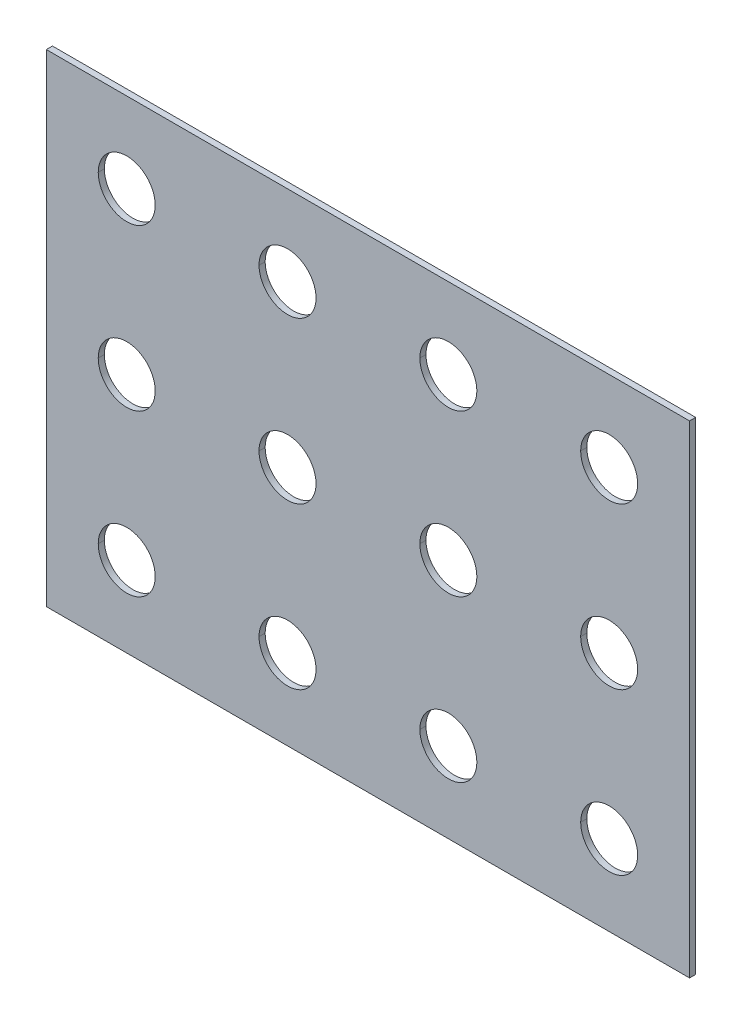
ISO-10303-21;
HEADER;
FILE_DESCRIPTION(('STEP AP214'),'2;1');
FILE_NAME('part.step','',(''),(''),'','','');
FILE_SCHEMA(('AUTOMOTIVE_DESIGN { 1 0 10303 214 1 1 1 1 }'));
ENDSEC;
DATA;
#1=APPLICATION_CONTEXT('core data for automotive mechanical design processes');
#2=APPLICATION_PROTOCOL_DEFINITION('international standard','automotive_design',2000,#1);
#3=PRODUCT_CONTEXT('',#1,'mechanical');
#4=PRODUCT('Part','Part','',(#3));
#5=PRODUCT_RELATED_PRODUCT_CATEGORY('part','',(#4));
#6=PRODUCT_DEFINITION_FORMATION('','',#4);
#7=PRODUCT_DEFINITION_CONTEXT('part definition',#1,'design');
#8=PRODUCT_DEFINITION('design','',#6,#7);
#9=PRODUCT_DEFINITION_SHAPE('','',#8);
#10=(LENGTH_UNIT() NAMED_UNIT(*) SI_UNIT(.MILLI.,.METRE.));
#11=(NAMED_UNIT(*) PLANE_ANGLE_UNIT() SI_UNIT($,.RADIAN.));
#12=(NAMED_UNIT(*) SI_UNIT($,.STERADIAN.) SOLID_ANGLE_UNIT());
#13=UNCERTAINTY_MEASURE_WITH_UNIT(LENGTH_MEASURE(1.E-05),#10,'distance_accuracy_value','');
#14=(GEOMETRIC_REPRESENTATION_CONTEXT(3) GLOBAL_UNCERTAINTY_ASSIGNED_CONTEXT((#13)) GLOBAL_UNIT_ASSIGNED_CONTEXT((#10,
#11,#12)) REPRESENTATION_CONTEXT('',''));
#15=CARTESIAN_POINT('',(0.,0.,0.));
#16=DIRECTION('',(0.,0.,1.));
#17=DIRECTION('',(1.,0.,0.));
#18=AXIS2_PLACEMENT_3D('',#15,#16,#17);
#19=CARTESIAN_POINT('',(0.,0.,0.));
#20=DIRECTION('',(-1.,0.,0.));
#21=DIRECTION('',(0.,0.,1.));
#22=AXIS2_PLACEMENT_3D('',#19,#20,#21);
#23=PLANE('',#22);
#24=DIRECTION('',(0.,0.,1.));
#25=VECTOR('',#24,1.);
#26=CARTESIAN_POINT('',(0.,0.,0.));
#27=LINE('',#26,#25);
#28=CARTESIAN_POINT('',(0.,0.,0.));
#29=VERTEX_POINT('',#28);
#30=CARTESIAN_POINT('',(0.,0.,0.09652));
#31=VERTEX_POINT('',#30);
#32=EDGE_CURVE('E272',#29,#31,#27,.T.);
#33=ORIENTED_EDGE('',*,*,#32,.T.);
#34=DIRECTION('',(0.,1.,0.));
#35=VECTOR('',#34,1.);
#36=CARTESIAN_POINT('',(0.,0.,0.09652));
#37=LINE('',#36,#35);
#38=CARTESIAN_POINT('',(0.,7.619999885559,0.09652));
#39=VERTEX_POINT('',#38);
#40=EDGE_CURVE('E280',#31,#39,#37,.T.);
#41=ORIENTED_EDGE('',*,*,#40,.T.);
#42=DIRECTION('',(0.,0.,1.));
#43=VECTOR('',#42,1.);
#44=CARTESIAN_POINT('',(0.,7.619999885559,0.));
#45=LINE('',#44,#43);
#46=CARTESIAN_POINT('',(0.,7.619999885559,0.));
#47=VERTEX_POINT('',#46);
#48=EDGE_CURVE('E11',#47,#39,#45,.T.);
#49=ORIENTED_EDGE('',*,*,#48,.F.);
#50=DIRECTION('',(0.,1.,0.));
#51=VECTOR('',#50,1.);
#52=CARTESIAN_POINT('',(0.,0.,0.));
#53=LINE('',#52,#51);
#54=EDGE_CURVE('E309',#29,#47,#53,.T.);
#55=ORIENTED_EDGE('',*,*,#54,.F.);
#56=EDGE_LOOP('',(#33,#41,#49,#55));
#57=FACE_BOUND('',#56,.T.);
#58=ADVANCED_FACE('F16',(#57),#23,.T.);
#59=CARTESIAN_POINT('',(0.,7.619999885559,0.));
#60=DIRECTION('',(0.,1.,0.));
#61=DIRECTION('',(1.,0.,0.));
#62=AXIS2_PLACEMENT_3D('',#59,#60,#61);
#63=PLANE('',#62);
#64=ORIENTED_EDGE('',*,*,#48,.T.);
#65=DIRECTION('',(1.,0.,0.));
#66=VECTOR('',#65,1.);
#67=CARTESIAN_POINT('',(0.,7.619999885559,0.09652));
#68=LINE('',#67,#66);
#69=CARTESIAN_POINT('',(10.159999847412,7.619999885559,0.09652));
#70=VERTEX_POINT('',#69);
#71=EDGE_CURVE('E275',#39,#70,#68,.T.);
#72=ORIENTED_EDGE('',*,*,#71,.T.);
#73=DIRECTION('',(0.,0.,1.));
#74=VECTOR('',#73,1.);
#75=CARTESIAN_POINT('',(10.159999847412,7.619999885559,0.));
#76=LINE('',#75,#74);
#77=CARTESIAN_POINT('',(10.159999847412,7.619999885559,0.));
#78=VERTEX_POINT('',#77);
#79=EDGE_CURVE('E27',#78,#70,#76,.T.);
#80=ORIENTED_EDGE('',*,*,#79,.F.);
#81=DIRECTION('',(1.,0.,0.));
#82=VECTOR('',#81,1.);
#83=CARTESIAN_POINT('',(0.,7.619999885559,0.));
#84=LINE('',#83,#82);
#85=EDGE_CURVE('E421',#47,#78,#84,.T.);
#86=ORIENTED_EDGE('',*,*,#85,.F.);
#87=EDGE_LOOP('',(#64,#72,#80,#86));
#88=FACE_BOUND('',#87,.T.);
#89=ADVANCED_FACE('F18',(#88),#63,.T.);
#90=CARTESIAN_POINT('',(10.159999847412,7.619999885559,0.));
#91=DIRECTION('',(1.,0.,0.));
#92=DIRECTION('',(0.,1.,0.));
#93=AXIS2_PLACEMENT_3D('',#90,#91,#92);
#94=PLANE('',#93);
#95=ORIENTED_EDGE('',*,*,#79,.T.);
#96=DIRECTION('',(0.,-1.,0.));
#97=VECTOR('',#96,1.);
#98=CARTESIAN_POINT('',(10.159999847412,7.619999885559,0.09652));
#99=LINE('',#98,#97);
#100=CARTESIAN_POINT('',(10.159999847412,0.,0.09652));
#101=VERTEX_POINT('',#100);
#102=EDGE_CURVE('E264',#70,#101,#99,.T.);
#103=ORIENTED_EDGE('',*,*,#102,.T.);
#104=DIRECTION('',(0.,0.,1.));
#105=VECTOR('',#104,1.);
#106=CARTESIAN_POINT('',(10.159999847412,0.,0.));
#107=LINE('',#106,#105);
#108=CARTESIAN_POINT('',(10.159999847412,0.,0.));
#109=VERTEX_POINT('',#108);
#110=EDGE_CURVE('E42',#109,#101,#107,.T.);
#111=ORIENTED_EDGE('',*,*,#110,.F.);
#112=DIRECTION('',(0.,-1.,0.));
#113=VECTOR('',#112,1.);
#114=CARTESIAN_POINT('',(10.159999847412,7.619999885559,0.));
#115=LINE('',#114,#113);
#116=EDGE_CURVE('E267',#78,#109,#115,.T.);
#117=ORIENTED_EDGE('',*,*,#116,.F.);
#118=EDGE_LOOP('',(#95,#103,#111,#117));
#119=FACE_BOUND('',#118,.T.);
#120=ADVANCED_FACE('F262',(#119),#94,.T.);
#121=CARTESIAN_POINT('',(10.159999847412,0.,0.));
#122=DIRECTION('',(0.,-1.,0.));
#123=DIRECTION('',(0.,0.,-1.));
#124=AXIS2_PLACEMENT_3D('',#121,#122,#123);
#125=PLANE('',#124);
#126=ORIENTED_EDGE('',*,*,#110,.T.);
#127=DIRECTION('',(-1.,0.,0.));
#128=VECTOR('',#127,1.);
#129=CARTESIAN_POINT('',(10.159999847412,0.,0.09652));
#130=LINE('',#129,#128);
#131=EDGE_CURVE('E284',#101,#31,#130,.T.);
#132=ORIENTED_EDGE('',*,*,#131,.T.);
#133=ORIENTED_EDGE('',*,*,#32,.F.);
#134=DIRECTION('',(-1.,0.,0.));
#135=VECTOR('',#134,1.);
#136=CARTESIAN_POINT('',(10.159999847412,0.,0.));
#137=LINE('',#136,#135);
#138=EDGE_CURVE('E420',#109,#29,#137,.T.);
#139=ORIENTED_EDGE('',*,*,#138,.F.);
#140=EDGE_LOOP('',(#126,#132,#133,#139));
#141=FACE_BOUND('',#140,.T.);
#142=ADVANCED_FACE('F1299',(#141),#125,.T.);
#143=CARTESIAN_POINT('',(1.27,3.81,0.));
#144=DIRECTION('',(0.,0.,-1.));
#145=DIRECTION('',(1.,0.,0.));
#146=AXIS2_PLACEMENT_3D('',#143,#144,#145);
#147=CYLINDRICAL_SURFACE('',#146,0.4499991);
#148=DIRECTION('',(0.,0.,-1.));
#149=VECTOR('',#148,1.);
#150=CARTESIAN_POINT('',(0.8200009,3.81,0.));
#151=LINE('',#150,#149);
#152=CARTESIAN_POINT('',(0.8200009,3.81,0.09652));
#153=VERTEX_POINT('',#152);
#154=CARTESIAN_POINT('',(0.8200009,3.81,0.));
#155=VERTEX_POINT('',#154);
#156=EDGE_CURVE('E409',#153,#155,#151,.T.);
#157=ORIENTED_EDGE('',*,*,#156,.F.);
#158=CARTESIAN_POINT('',(1.27,3.81,0.09652));
#159=DIRECTION('',(0.,0.,1.));
#160=DIRECTION('',(1.,0.,0.));
#161=AXIS2_PLACEMENT_3D('',#158,#159,#160);
#162=CIRCLE('',#161,0.4499991);
#163=CARTESIAN_POINT('',(1.7199991,3.81,0.09652));
#164=VERTEX_POINT('',#163);
#165=EDGE_CURVE('E306',#153,#164,#162,.T.);
#166=ORIENTED_EDGE('',*,*,#165,.T.);
#167=DIRECTION('',(0.,0.,-1.));
#168=VECTOR('',#167,1.);
#169=CARTESIAN_POINT('',(1.7199991,3.81,0.));
#170=LINE('',#169,#168);
#171=CARTESIAN_POINT('',(1.7199991,3.81,0.));
#172=VERTEX_POINT('',#171);
#173=EDGE_CURVE('E437',#164,#172,#170,.T.);
#174=ORIENTED_EDGE('',*,*,#173,.T.);
#175=CARTESIAN_POINT('',(1.27,3.81,0.));
#176=DIRECTION('',(0.,0.,1.));
#177=DIRECTION('',(1.,0.,0.));
#178=AXIS2_PLACEMENT_3D('',#175,#176,#177);
#179=CIRCLE('',#178,0.4499991);
#180=EDGE_CURVE('E20',#155,#172,#179,.T.);
#181=ORIENTED_EDGE('',*,*,#180,.F.);
#182=EDGE_LOOP('',(#157,#166,#174,#181));
#183=FACE_BOUND('',#182,.T.);
#184=ADVANCED_FACE('F621',(#183),#147,.F.);
#185=CARTESIAN_POINT('',(3.81,1.27,0.));
#186=DIRECTION('',(0.,0.,-1.));
#187=DIRECTION('',(1.,0.,0.));
#188=AXIS2_PLACEMENT_3D('',#185,#186,#187);
#189=CYLINDRICAL_SURFACE('',#188,0.4499991);
#190=DIRECTION('',(0.,0.,-1.));
#191=VECTOR('',#190,1.);
#192=CARTESIAN_POINT('',(3.3600009,1.27,0.));
#193=LINE('',#192,#191);
#194=CARTESIAN_POINT('',(3.3600009,1.27,0.09652));
#195=VERTEX_POINT('',#194);
#196=CARTESIAN_POINT('',(3.3600009,1.27,0.));
#197=VERTEX_POINT('',#196);
#198=EDGE_CURVE('E340',#195,#197,#193,.T.);
#199=ORIENTED_EDGE('',*,*,#198,.F.);
#200=CARTESIAN_POINT('',(3.81,1.27,0.09652));
#201=DIRECTION('',(0.,0.,1.));
#202=DIRECTION('',(1.,0.,0.));
#203=AXIS2_PLACEMENT_3D('',#200,#201,#202);
#204=CIRCLE('',#203,0.4499991);
#205=CARTESIAN_POINT('',(4.2599991,1.27,0.09652));
#206=VERTEX_POINT('',#205);
#207=EDGE_CURVE('E300',#195,#206,#204,.T.);
#208=ORIENTED_EDGE('',*,*,#207,.T.);
#209=DIRECTION('',(0.,0.,-1.));
#210=VECTOR('',#209,1.);
#211=CARTESIAN_POINT('',(4.2599991,1.27,0.));
#212=LINE('',#211,#210);
#213=CARTESIAN_POINT('',(4.2599991,1.27,0.));
#214=VERTEX_POINT('',#213);
#215=EDGE_CURVE('E388',#206,#214,#212,.T.);
#216=ORIENTED_EDGE('',*,*,#215,.T.);
#217=CARTESIAN_POINT('',(3.81,1.27,0.));
#218=DIRECTION('',(0.,0.,1.));
#219=DIRECTION('',(1.,0.,0.));
#220=AXIS2_PLACEMENT_3D('',#217,#218,#219);
#221=CIRCLE('',#220,0.4499991);
#222=EDGE_CURVE('E363',#197,#214,#221,.T.);
#223=ORIENTED_EDGE('',*,*,#222,.F.);
#224=EDGE_LOOP('',(#199,#208,#216,#223));
#225=FACE_BOUND('',#224,.T.);
#226=ADVANCED_FACE('F1278',(#225),#189,.F.);
#227=CARTESIAN_POINT('',(1.27,1.27,0.));
#228=DIRECTION('',(0.,0.,-1.));
#229=DIRECTION('',(1.,0.,0.));
#230=AXIS2_PLACEMENT_3D('',#227,#228,#229);
#231=CYLINDRICAL_SURFACE('',#230,0.4499991);
#232=DIRECTION('',(0.,0.,-1.));
#233=VECTOR('',#232,1.);
#234=CARTESIAN_POINT('',(0.8200009,1.27,0.));
#235=LINE('',#234,#233);
#236=CARTESIAN_POINT('',(0.8200009,1.27,0.09652));
#237=VERTEX_POINT('',#236);
#238=CARTESIAN_POINT('',(0.8200009,1.27,0.));
#239=VERTEX_POINT('',#238);
#240=EDGE_CURVE('E319',#237,#239,#235,.T.);
#241=ORIENTED_EDGE('',*,*,#240,.F.);
#242=CARTESIAN_POINT('',(1.27,1.27,0.09652));
#243=DIRECTION('',(0.,0.,1.));
#244=DIRECTION('',(1.,0.,0.));
#245=AXIS2_PLACEMENT_3D('',#242,#243,#244);
#246=CIRCLE('',#245,0.4499991);
#247=CARTESIAN_POINT('',(1.7199991,1.27,0.09652));
#248=VERTEX_POINT('',#247);
#249=EDGE_CURVE('E297',#237,#248,#246,.T.);
#250=ORIENTED_EDGE('',*,*,#249,.T.);
#251=DIRECTION('',(0.,0.,-1.));
#252=VECTOR('',#251,1.);
#253=CARTESIAN_POINT('',(1.7199991,1.27,0.));
#254=LINE('',#253,#252);
#255=CARTESIAN_POINT('',(1.7199991,1.27,0.));
#256=VERTEX_POINT('',#255);
#257=EDGE_CURVE('E455',#248,#256,#254,.T.);
#258=ORIENTED_EDGE('',*,*,#257,.T.);
#259=CARTESIAN_POINT('',(1.27,1.27,0.));
#260=DIRECTION('',(0.,0.,1.));
#261=DIRECTION('',(1.,0.,0.));
#262=AXIS2_PLACEMENT_3D('',#259,#260,#261);
#263=CIRCLE('',#262,0.4499991);
#264=EDGE_CURVE('E146',#239,#256,#263,.T.);
#265=ORIENTED_EDGE('',*,*,#264,.F.);
#266=EDGE_LOOP('',(#241,#250,#258,#265));
#267=FACE_BOUND('',#266,.T.);
#268=ADVANCED_FACE('F1267',(#267),#231,.F.);
#269=CARTESIAN_POINT('',(1.27,6.35,0.));
#270=DIRECTION('',(0.,0.,-1.));
#271=DIRECTION('',(1.,0.,0.));
#272=AXIS2_PLACEMENT_3D('',#269,#270,#271);
#273=CYLINDRICAL_SURFACE('',#272,0.4499991);
#274=DIRECTION('',(0.,0.,-1.));
#275=VECTOR('',#274,1.);
#276=CARTESIAN_POINT('',(0.8200009,6.35,0.));
#277=LINE('',#276,#275);
#278=CARTESIAN_POINT('',(0.8200009,6.35,0.09652));
#279=VERTEX_POINT('',#278);
#280=CARTESIAN_POINT('',(0.8200009,6.35,0.));
#281=VERTEX_POINT('',#280);
#282=EDGE_CURVE('E357',#279,#281,#277,.T.);
#283=ORIENTED_EDGE('',*,*,#282,.F.);
#284=CARTESIAN_POINT('',(1.27,6.35,0.09652));
#285=DIRECTION('',(0.,0.,1.));
#286=DIRECTION('',(1.,0.,0.));
#287=AXIS2_PLACEMENT_3D('',#284,#285,#286);
#288=CIRCLE('',#287,0.4499991);
#289=CARTESIAN_POINT('',(1.7199991,6.35,0.09652));
#290=VERTEX_POINT('',#289);
#291=EDGE_CURVE('E130',#279,#290,#288,.T.);
#292=ORIENTED_EDGE('',*,*,#291,.T.);
#293=DIRECTION('',(0.,0.,-1.));
#294=VECTOR('',#293,1.);
#295=CARTESIAN_POINT('',(1.7199991,6.35,0.));
#296=LINE('',#295,#294);
#297=CARTESIAN_POINT('',(1.7199991,6.35,0.));
#298=VERTEX_POINT('',#297);
#299=EDGE_CURVE('E356',#290,#298,#296,.T.);
#300=ORIENTED_EDGE('',*,*,#299,.T.);
#301=CARTESIAN_POINT('',(1.27,6.35,0.));
#302=DIRECTION('',(0.,0.,1.));
#303=DIRECTION('',(1.,0.,0.));
#304=AXIS2_PLACEMENT_3D('',#301,#302,#303);
#305=CIRCLE('',#304,0.4499991);
#306=EDGE_CURVE('E336',#281,#298,#305,.T.);
#307=ORIENTED_EDGE('',*,*,#306,.F.);
#308=EDGE_LOOP('',(#283,#292,#300,#307));
#309=FACE_BOUND('',#308,.T.);
#310=ADVANCED_FACE('F1256',(#309),#273,.F.);
#311=CARTESIAN_POINT('',(3.81,3.81,0.));
#312=DIRECTION('',(0.,0.,-1.));
#313=DIRECTION('',(1.,0.,0.));
#314=AXIS2_PLACEMENT_3D('',#311,#312,#313);
#315=CYLINDRICAL_SURFACE('',#314,0.4499991);
#316=DIRECTION('',(0.,0.,-1.));
#317=VECTOR('',#316,1.);
#318=CARTESIAN_POINT('',(3.3600009,3.81,0.));
#319=LINE('',#318,#317);
#320=CARTESIAN_POINT('',(3.3600009,3.81,0.09652));
#321=VERTEX_POINT('',#320);
#322=CARTESIAN_POINT('',(3.3600009,3.81,0.));
#323=VERTEX_POINT('',#322);
#324=EDGE_CURVE('E370',#321,#323,#319,.T.);
#325=ORIENTED_EDGE('',*,*,#324,.F.);
#326=CARTESIAN_POINT('',(3.81,3.81,0.09652));
#327=DIRECTION('',(0.,0.,1.));
#328=DIRECTION('',(1.,0.,0.));
#329=AXIS2_PLACEMENT_3D('',#326,#327,#328);
#330=CIRCLE('',#329,0.4499991);
#331=CARTESIAN_POINT('',(4.2599991,3.81,0.09652));
#332=VERTEX_POINT('',#331);
#333=EDGE_CURVE('E404',#321,#332,#330,.T.);
#334=ORIENTED_EDGE('',*,*,#333,.T.);
#335=DIRECTION('',(0.,0.,-1.));
#336=VECTOR('',#335,1.);
#337=CARTESIAN_POINT('',(4.2599991,3.81,0.));
#338=LINE('',#337,#336);
#339=CARTESIAN_POINT('',(4.2599991,3.81,0.));
#340=VERTEX_POINT('',#339);
#341=EDGE_CURVE('E376',#332,#340,#338,.T.);
#342=ORIENTED_EDGE('',*,*,#341,.T.);
#343=CARTESIAN_POINT('',(3.81,3.81,0.));
#344=DIRECTION('',(0.,0.,1.));
#345=DIRECTION('',(1.,0.,0.));
#346=AXIS2_PLACEMENT_3D('',#343,#344,#345);
#347=CIRCLE('',#346,0.4499991);
#348=EDGE_CURVE('E339',#323,#340,#347,.T.);
#349=ORIENTED_EDGE('',*,*,#348,.F.);
#350=EDGE_LOOP('',(#325,#334,#342,#349));
#351=FACE_BOUND('',#350,.T.);
#352=ADVANCED_FACE('F1245',(#351),#315,.F.);
#353=CARTESIAN_POINT('',(3.81,6.35,0.));
#354=DIRECTION('',(0.,0.,-1.));
#355=DIRECTION('',(1.,0.,0.));
#356=AXIS2_PLACEMENT_3D('',#353,#354,#355);
#357=CYLINDRICAL_SURFACE('',#356,0.4499991);
#358=DIRECTION('',(0.,0.,-1.));
#359=VECTOR('',#358,1.);
#360=CARTESIAN_POINT('',(3.3600009,6.35,0.));
#361=LINE('',#360,#359);
#362=CARTESIAN_POINT('',(3.3600009,6.35,0.09652));
#363=VERTEX_POINT('',#362);
#364=CARTESIAN_POINT('',(3.3600009,6.35,0.));
#365=VERTEX_POINT('',#364);
#366=EDGE_CURVE('E375',#363,#365,#361,.T.);
#367=ORIENTED_EDGE('',*,*,#366,.F.);
#368=CARTESIAN_POINT('',(3.81,6.35,0.09652));
#369=DIRECTION('',(0.,0.,1.));
#370=DIRECTION('',(1.,0.,0.));
#371=AXIS2_PLACEMENT_3D('',#368,#369,#370);
#372=CIRCLE('',#371,0.4499991);
#373=CARTESIAN_POINT('',(4.2599991,6.35,0.09652));
#374=VERTEX_POINT('',#373);
#375=EDGE_CURVE('E466',#363,#374,#372,.T.);
#376=ORIENTED_EDGE('',*,*,#375,.T.);
#377=DIRECTION('',(0.,0.,-1.));
#378=VECTOR('',#377,1.);
#379=CARTESIAN_POINT('',(4.2599991,6.35,0.));
#380=LINE('',#379,#378);
#381=CARTESIAN_POINT('',(4.2599991,6.35,0.));
#382=VERTEX_POINT('',#381);
#383=EDGE_CURVE('E496',#374,#382,#380,.T.);
#384=ORIENTED_EDGE('',*,*,#383,.T.);
#385=CARTESIAN_POINT('',(3.81,6.35,0.));
#386=DIRECTION('',(0.,0.,1.));
#387=DIRECTION('',(1.,0.,0.));
#388=AXIS2_PLACEMENT_3D('',#385,#386,#387);
#389=CIRCLE('',#388,0.4499991);
#390=EDGE_CURVE('E379',#365,#382,#389,.T.);
#391=ORIENTED_EDGE('',*,*,#390,.F.);
#392=EDGE_LOOP('',(#367,#376,#384,#391));
#393=FACE_BOUND('',#392,.T.);
#394=ADVANCED_FACE('F1234',(#393),#357,.F.);
#395=CARTESIAN_POINT('',(6.35,3.81,0.));
#396=DIRECTION('',(0.,0.,-1.));
#397=DIRECTION('',(1.,0.,0.));
#398=AXIS2_PLACEMENT_3D('',#395,#396,#397);
#399=CYLINDRICAL_SURFACE('',#398,0.4499991);
#400=DIRECTION('',(0.,0.,-1.));
#401=VECTOR('',#400,1.);
#402=CARTESIAN_POINT('',(5.9000009,3.81,0.));
#403=LINE('',#402,#401);
#404=CARTESIAN_POINT('',(5.9000009,3.81,0.09652));
#405=VERTEX_POINT('',#404);
#406=CARTESIAN_POINT('',(5.9000009,3.81,0.));
#407=VERTEX_POINT('',#406);
#408=EDGE_CURVE('E414',#405,#407,#403,.T.);
#409=ORIENTED_EDGE('',*,*,#408,.F.);
#410=CARTESIAN_POINT('',(6.35,3.81,0.09652));
#411=DIRECTION('',(0.,0.,1.));
#412=DIRECTION('',(1.,0.,0.));
#413=AXIS2_PLACEMENT_3D('',#410,#411,#412);
#414=CIRCLE('',#413,0.4499991);
#415=CARTESIAN_POINT('',(6.7999991,3.81,0.09652));
#416=VERTEX_POINT('',#415);
#417=EDGE_CURVE('E327',#405,#416,#414,.T.);
#418=ORIENTED_EDGE('',*,*,#417,.T.);
#419=DIRECTION('',(0.,0.,-1.));
#420=VECTOR('',#419,1.);
#421=CARTESIAN_POINT('',(6.7999991,3.81,0.));
#422=LINE('',#421,#420);
#423=CARTESIAN_POINT('',(6.7999991,3.81,0.));
#424=VERTEX_POINT('',#423);
#425=EDGE_CURVE('E351',#416,#424,#422,.T.);
#426=ORIENTED_EDGE('',*,*,#425,.T.);
#427=CARTESIAN_POINT('',(6.35,3.81,0.));
#428=DIRECTION('',(0.,0.,1.));
#429=DIRECTION('',(1.,0.,0.));
#430=AXIS2_PLACEMENT_3D('',#427,#428,#429);
#431=CIRCLE('',#430,0.4499991);
#432=EDGE_CURVE('E377',#407,#424,#431,.T.);
#433=ORIENTED_EDGE('',*,*,#432,.F.);
#434=EDGE_LOOP('',(#409,#418,#426,#433));
#435=FACE_BOUND('',#434,.T.);
#436=ADVANCED_FACE('F1223',(#435),#399,.F.);
#437=CARTESIAN_POINT('',(8.89,1.27,0.));
#438=DIRECTION('',(0.,0.,-1.));
#439=DIRECTION('',(1.,0.,0.));
#440=AXIS2_PLACEMENT_3D('',#437,#438,#439);
#441=CYLINDRICAL_SURFACE('',#440,0.4499991);
#442=DIRECTION('',(0.,0.,-1.));
#443=VECTOR('',#442,1.);
#444=CARTESIAN_POINT('',(8.4400009,1.27,0.));
#445=LINE('',#444,#443);
#446=CARTESIAN_POINT('',(8.4400009,1.27,0.09652));
#447=VERTEX_POINT('',#446);
#448=CARTESIAN_POINT('',(8.4400009,1.27,0.));
#449=VERTEX_POINT('',#448);
#450=EDGE_CURVE('E350',#447,#449,#445,.T.);
#451=ORIENTED_EDGE('',*,*,#450,.F.);
#452=CARTESIAN_POINT('',(8.89,1.27,0.09652));
#453=DIRECTION('',(0.,0.,1.));
#454=DIRECTION('',(1.,0.,0.));
#455=AXIS2_PLACEMENT_3D('',#452,#453,#454);
#456=CIRCLE('',#455,0.4499991);
#457=CARTESIAN_POINT('',(9.3399991,1.27,0.09652));
#458=VERTEX_POINT('',#457);
#459=EDGE_CURVE('E318',#447,#458,#456,.T.);
#460=ORIENTED_EDGE('',*,*,#459,.T.);
#461=DIRECTION('',(0.,0.,-1.));
#462=VECTOR('',#461,1.);
#463=CARTESIAN_POINT('',(9.3399991,1.27,0.));
#464=LINE('',#463,#462);
#465=CARTESIAN_POINT('',(9.3399991,1.27,0.));
#466=VERTEX_POINT('',#465);
#467=EDGE_CURVE('E398',#458,#466,#464,.T.);
#468=ORIENTED_EDGE('',*,*,#467,.T.);
#469=CARTESIAN_POINT('',(8.89,1.27,0.));
#470=DIRECTION('',(0.,0.,1.));
#471=DIRECTION('',(1.,0.,0.));
#472=AXIS2_PLACEMENT_3D('',#469,#470,#471);
#473=CIRCLE('',#472,0.4499991);
#474=EDGE_CURVE('E380',#449,#466,#473,.T.);
#475=ORIENTED_EDGE('',*,*,#474,.F.);
#476=EDGE_LOOP('',(#451,#460,#468,#475));
#477=FACE_BOUND('',#476,.T.);
#478=ADVANCED_FACE('F1213',(#477),#441,.F.);
#479=CARTESIAN_POINT('',(6.35,1.27,0.));
#480=DIRECTION('',(0.,0.,-1.));
#481=DIRECTION('',(1.,0.,0.));
#482=AXIS2_PLACEMENT_3D('',#479,#480,#481);
#483=CYLINDRICAL_SURFACE('',#482,0.4499991);
#484=DIRECTION('',(0.,0.,-1.));
#485=VECTOR('',#484,1.);
#486=CARTESIAN_POINT('',(5.9000009,1.27,0.));
#487=LINE('',#486,#485);
#488=CARTESIAN_POINT('',(5.9000009,1.27,0.09652));
#489=VERTEX_POINT('',#488);
#490=CARTESIAN_POINT('',(5.9000009,1.27,0.));
#491=VERTEX_POINT('',#490);
#492=EDGE_CURVE('E397',#489,#491,#487,.T.);
#493=ORIENTED_EDGE('',*,*,#492,.F.);
#494=CARTESIAN_POINT('',(6.35,1.27,0.09652));
#495=DIRECTION('',(0.,0.,1.));
#496=DIRECTION('',(1.,0.,0.));
#497=AXIS2_PLACEMENT_3D('',#494,#495,#496);
#498=CIRCLE('',#497,0.4499991);
#499=CARTESIAN_POINT('',(6.7999991,1.27,0.09652));
#500=VERTEX_POINT('',#499);
#501=EDGE_CURVE('E304',#489,#500,#498,.T.);
#502=ORIENTED_EDGE('',*,*,#501,.T.);
#503=DIRECTION('',(0.,0.,-1.));
#504=VECTOR('',#503,1.);
#505=CARTESIAN_POINT('',(6.7999991,1.27,0.));
#506=LINE('',#505,#504);
#507=CARTESIAN_POINT('',(6.7999991,1.27,0.));
#508=VERTEX_POINT('',#507);
#509=EDGE_CURVE('E315',#500,#508,#506,.T.);
#510=ORIENTED_EDGE('',*,*,#509,.T.);
#511=CARTESIAN_POINT('',(6.35,1.27,0.));
#512=DIRECTION('',(0.,0.,1.));
#513=DIRECTION('',(1.,0.,0.));
#514=AXIS2_PLACEMENT_3D('',#511,#512,#513);
#515=CIRCLE('',#514,0.4499991);
#516=EDGE_CURVE('E295',#491,#508,#515,.T.);
#517=ORIENTED_EDGE('',*,*,#516,.F.);
#518=EDGE_LOOP('',(#493,#502,#510,#517));
#519=FACE_BOUND('',#518,.T.);
#520=ADVANCED_FACE('F557',(#519),#483,.F.);
#521=CARTESIAN_POINT('',(6.35,6.35,0.));
#522=DIRECTION('',(0.,0.,-1.));
#523=DIRECTION('',(1.,0.,0.));
#524=AXIS2_PLACEMENT_3D('',#521,#522,#523);
#525=CYLINDRICAL_SURFACE('',#524,0.4499991);
#526=DIRECTION('',(0.,0.,-1.));
#527=VECTOR('',#526,1.);
#528=CARTESIAN_POINT('',(5.9000009,6.35,0.));
#529=LINE('',#528,#527);
#530=CARTESIAN_POINT('',(5.9000009,6.35,0.09652));
#531=VERTEX_POINT('',#530);
#532=CARTESIAN_POINT('',(5.9000009,6.35,0.));
#533=VERTEX_POINT('',#532);
#534=EDGE_CURVE('E314',#531,#533,#529,.T.);
#535=ORIENTED_EDGE('',*,*,#534,.F.);
#536=CARTESIAN_POINT('',(6.35,6.35,0.09652));
#537=DIRECTION('',(0.,0.,1.));
#538=DIRECTION('',(1.,0.,0.));
#539=AXIS2_PLACEMENT_3D('',#536,#537,#538);
#540=CIRCLE('',#539,0.4499991);
#541=CARTESIAN_POINT('',(6.7999991,6.35,0.09652));
#542=VERTEX_POINT('',#541);
#543=EDGE_CURVE('E301',#531,#542,#540,.T.);
#544=ORIENTED_EDGE('',*,*,#543,.T.);
#545=DIRECTION('',(0.,0.,-1.));
#546=VECTOR('',#545,1.);
#547=CARTESIAN_POINT('',(6.7999991,6.35,0.));
#548=LINE('',#547,#546);
#549=CARTESIAN_POINT('',(6.7999991,6.35,0.));
#550=VERTEX_POINT('',#549);
#551=EDGE_CURVE('E335',#542,#550,#548,.T.);
#552=ORIENTED_EDGE('',*,*,#551,.T.);
#553=CARTESIAN_POINT('',(6.35,6.35,0.));
#554=DIRECTION('',(0.,0.,1.));
#555=DIRECTION('',(1.,0.,0.));
#556=AXIS2_PLACEMENT_3D('',#553,#554,#555);
#557=CIRCLE('',#556,0.4499991);
#558=EDGE_CURVE('E444',#533,#550,#557,.T.);
#559=ORIENTED_EDGE('',*,*,#558,.F.);
#560=EDGE_LOOP('',(#535,#544,#552,#559));
#561=FACE_BOUND('',#560,.T.);
#562=ADVANCED_FACE('F1190',(#561),#525,.F.);
#563=CARTESIAN_POINT('',(8.89,3.81,0.));
#564=DIRECTION('',(0.,0.,-1.));
#565=DIRECTION('',(1.,0.,0.));
#566=AXIS2_PLACEMENT_3D('',#563,#564,#565);
#567=CYLINDRICAL_SURFACE('',#566,0.4499991);
#568=DIRECTION('',(0.,0.,-1.));
#569=VECTOR('',#568,1.);
#570=CARTESIAN_POINT('',(8.4400009,3.81,0.));
#571=LINE('',#570,#569);
#572=CARTESIAN_POINT('',(8.4400009,3.81,0.09652));
#573=VERTEX_POINT('',#572);
#574=CARTESIAN_POINT('',(8.4400009,3.81,0.));
#575=VERTEX_POINT('',#574);
#576=EDGE_CURVE('E334',#573,#575,#571,.T.);
#577=ORIENTED_EDGE('',*,*,#576,.F.);
#578=CARTESIAN_POINT('',(8.89,3.81,0.09652));
#579=DIRECTION('',(0.,0.,1.));
#580=DIRECTION('',(1.,0.,0.));
#581=AXIS2_PLACEMENT_3D('',#578,#579,#580);
#582=CIRCLE('',#581,0.4499991);
#583=CARTESIAN_POINT('',(9.3399991,3.81,0.09652));
#584=VERTEX_POINT('',#583);
#585=EDGE_CURVE('E305',#573,#584,#582,.T.);
#586=ORIENTED_EDGE('',*,*,#585,.T.);
#587=DIRECTION('',(0.,0.,-1.));
#588=VECTOR('',#587,1.);
#589=CARTESIAN_POINT('',(9.3399991,3.81,0.));
#590=LINE('',#589,#588);
#591=CARTESIAN_POINT('',(9.3399991,3.81,0.));
#592=VERTEX_POINT('',#591);
#593=EDGE_CURVE('E362',#584,#592,#590,.T.);
#594=ORIENTED_EDGE('',*,*,#593,.T.);
#595=CARTESIAN_POINT('',(8.89,3.81,0.));
#596=DIRECTION('',(0.,0.,1.));
#597=DIRECTION('',(1.,0.,0.));
#598=AXIS2_PLACEMENT_3D('',#595,#596,#597);
#599=CIRCLE('',#598,0.4499991);
#600=EDGE_CURVE('E441',#575,#592,#599,.T.);
#601=ORIENTED_EDGE('',*,*,#600,.F.);
#602=EDGE_LOOP('',(#577,#586,#594,#601));
#603=FACE_BOUND('',#602,.T.);
#604=ADVANCED_FACE('F1178',(#603),#567,.F.);
#605=CARTESIAN_POINT('',(8.89,6.35,0.));
#606=DIRECTION('',(0.,0.,-1.));
#607=DIRECTION('',(1.,0.,0.));
#608=AXIS2_PLACEMENT_3D('',#605,#606,#607);
#609=CYLINDRICAL_SURFACE('',#608,0.4499991);
#610=DIRECTION('',(0.,0.,-1.));
#611=VECTOR('',#610,1.);
#612=CARTESIAN_POINT('',(8.4400009,6.35,0.));
#613=LINE('',#612,#611);
#614=CARTESIAN_POINT('',(8.4400009,6.35,0.09652));
#615=VERTEX_POINT('',#614);
#616=CARTESIAN_POINT('',(8.4400009,6.35,0.));
#617=VERTEX_POINT('',#616);
#618=EDGE_CURVE('E491',#615,#617,#613,.T.);
#619=ORIENTED_EDGE('',*,*,#618,.F.);
#620=CARTESIAN_POINT('',(8.89,6.35,0.09652));
#621=DIRECTION('',(0.,0.,1.));
#622=DIRECTION('',(1.,0.,0.));
#623=AXIS2_PLACEMENT_3D('',#620,#621,#622);
#624=CIRCLE('',#623,0.4499991);
#625=CARTESIAN_POINT('',(9.3399991,6.35,0.09652));
#626=VERTEX_POINT('',#625);
#627=EDGE_CURVE('E401',#615,#626,#624,.T.);
#628=ORIENTED_EDGE('',*,*,#627,.T.);
#629=DIRECTION('',(0.,0.,-1.));
#630=VECTOR('',#629,1.);
#631=CARTESIAN_POINT('',(9.3399991,6.35,0.));
#632=LINE('',#631,#630);
#633=CARTESIAN_POINT('',(9.3399991,6.35,0.));
#634=VERTEX_POINT('',#633);
#635=EDGE_CURVE('E291',#626,#634,#632,.T.);
#636=ORIENTED_EDGE('',*,*,#635,.T.);
#637=CARTESIAN_POINT('',(8.89,6.35,0.));
#638=DIRECTION('',(0.,0.,1.));
#639=DIRECTION('',(1.,0.,0.));
#640=AXIS2_PLACEMENT_3D('',#637,#638,#639);
#641=CIRCLE('',#640,0.4499991);
#642=EDGE_CURVE('E445',#617,#634,#641,.T.);
#643=ORIENTED_EDGE('',*,*,#642,.F.);
#644=EDGE_LOOP('',(#619,#628,#636,#643));
#645=FACE_BOUND('',#644,.T.);
#646=ADVANCED_FACE('F563',(#645),#609,.F.);
#647=CARTESIAN_POINT('',(0.,0.,0.));
#648=DIRECTION('',(0.,0.,1.));
#649=DIRECTION('',(1.,0.,0.));
#650=AXIS2_PLACEMENT_3D('',#647,#648,#649);
#651=PLANE('',#650);
#652=CARTESIAN_POINT('',(1.27,3.81,0.));
#653=DIRECTION('',(0.,0.,1.));
#654=DIRECTION('',(1.,0.,0.));
#655=AXIS2_PLACEMENT_3D('',#652,#653,#654);
#656=CIRCLE('',#655,0.4499991);
#657=EDGE_CURVE('E436',#172,#155,#656,.T.);
#658=ORIENTED_EDGE('',*,*,#657,.T.);
#659=ORIENTED_EDGE('',*,*,#180,.T.);
#660=EDGE_LOOP('',(#658,#659));
#661=FACE_BOUND('',#660,.T.);
#662=CARTESIAN_POINT('',(3.81,1.27,0.));
#663=DIRECTION('',(0.,0.,1.));
#664=DIRECTION('',(1.,0.,0.));
#665=AXIS2_PLACEMENT_3D('',#662,#663,#664);
#666=CIRCLE('',#665,0.4499991);
#667=EDGE_CURVE('E344',#214,#197,#666,.T.);
#668=ORIENTED_EDGE('',*,*,#667,.T.);
#669=ORIENTED_EDGE('',*,*,#222,.T.);
#670=EDGE_LOOP('',(#668,#669));
#671=FACE_BOUND('',#670,.T.);
#672=CARTESIAN_POINT('',(1.27,1.27,0.));
#673=DIRECTION('',(0.,0.,1.));
#674=DIRECTION('',(1.,0.,0.));
#675=AXIS2_PLACEMENT_3D('',#672,#673,#674);
#676=CIRCLE('',#675,0.4499991);
#677=EDGE_CURVE('E323',#256,#239,#676,.T.);
#678=ORIENTED_EDGE('',*,*,#677,.T.);
#679=ORIENTED_EDGE('',*,*,#264,.T.);
#680=EDGE_LOOP('',(#678,#679));
#681=FACE_BOUND('',#680,.T.);
#682=CARTESIAN_POINT('',(1.27,6.35,0.));
#683=DIRECTION('',(0.,0.,1.));
#684=DIRECTION('',(1.,0.,0.));
#685=AXIS2_PLACEMENT_3D('',#682,#683,#684);
#686=CIRCLE('',#685,0.4499991);
#687=EDGE_CURVE('E352',#298,#281,#686,.T.);
#688=ORIENTED_EDGE('',*,*,#687,.T.);
#689=ORIENTED_EDGE('',*,*,#306,.T.);
#690=EDGE_LOOP('',(#688,#689));
#691=FACE_BOUND('',#690,.T.);
#692=CARTESIAN_POINT('',(3.81,3.81,0.));
#693=DIRECTION('',(0.,0.,1.));
#694=DIRECTION('',(1.,0.,0.));
#695=AXIS2_PLACEMENT_3D('',#692,#693,#694);
#696=CIRCLE('',#695,0.4499991);
#697=EDGE_CURVE('E476',#340,#323,#696,.T.);
#698=ORIENTED_EDGE('',*,*,#697,.T.);
#699=ORIENTED_EDGE('',*,*,#348,.T.);
#700=EDGE_LOOP('',(#698,#699));
#701=FACE_BOUND('',#700,.T.);
#702=CARTESIAN_POINT('',(3.81,6.35,0.));
#703=DIRECTION('',(0.,0.,1.));
#704=DIRECTION('',(1.,0.,0.));
#705=AXIS2_PLACEMENT_3D('',#702,#703,#704);
#706=CIRCLE('',#705,0.4499991);
#707=EDGE_CURVE('E427',#382,#365,#706,.T.);
#708=ORIENTED_EDGE('',*,*,#707,.T.);
#709=ORIENTED_EDGE('',*,*,#390,.T.);
#710=EDGE_LOOP('',(#708,#709));
#711=FACE_BOUND('',#710,.T.);
#712=CARTESIAN_POINT('',(6.35,3.81,0.));
#713=DIRECTION('',(0.,0.,1.));
#714=DIRECTION('',(1.,0.,0.));
#715=AXIS2_PLACEMENT_3D('',#712,#713,#714);
#716=CIRCLE('',#715,0.4499991);
#717=EDGE_CURVE('E410',#424,#407,#716,.T.);
#718=ORIENTED_EDGE('',*,*,#717,.T.);
#719=ORIENTED_EDGE('',*,*,#432,.T.);
#720=EDGE_LOOP('',(#718,#719));
#721=FACE_BOUND('',#720,.T.);
#722=CARTESIAN_POINT('',(8.89,1.27,0.));
#723=DIRECTION('',(0.,0.,1.));
#724=DIRECTION('',(1.,0.,0.));
#725=AXIS2_PLACEMENT_3D('',#722,#723,#724);
#726=CIRCLE('',#725,0.4499991);
#727=EDGE_CURVE('E500',#466,#449,#726,.T.);
#728=ORIENTED_EDGE('',*,*,#727,.T.);
#729=ORIENTED_EDGE('',*,*,#474,.T.);
#730=EDGE_LOOP('',(#728,#729));
#731=FACE_BOUND('',#730,.T.);
#732=CARTESIAN_POINT('',(6.35,1.27,0.));
#733=DIRECTION('',(0.,0.,1.));
#734=DIRECTION('',(1.,0.,0.));
#735=AXIS2_PLACEMENT_3D('',#732,#733,#734);
#736=CIRCLE('',#735,0.4499991);
#737=EDGE_CURVE('E392',#508,#491,#736,.T.);
#738=ORIENTED_EDGE('',*,*,#737,.T.);
#739=ORIENTED_EDGE('',*,*,#516,.T.);
#740=EDGE_LOOP('',(#738,#739));
#741=FACE_BOUND('',#740,.T.);
#742=CARTESIAN_POINT('',(6.35,6.35,0.));
#743=DIRECTION('',(0.,0.,1.));
#744=DIRECTION('',(1.,0.,0.));
#745=AXIS2_PLACEMENT_3D('',#742,#743,#744);
#746=CIRCLE('',#745,0.4499991);
#747=EDGE_CURVE('E469',#550,#533,#746,.T.);
#748=ORIENTED_EDGE('',*,*,#747,.T.);
#749=ORIENTED_EDGE('',*,*,#558,.T.);
#750=EDGE_LOOP('',(#748,#749));
#751=FACE_BOUND('',#750,.T.);
#752=CARTESIAN_POINT('',(8.89,3.81,0.));
#753=DIRECTION('',(0.,0.,1.));
#754=DIRECTION('',(1.,0.,0.));
#755=AXIS2_PLACEMENT_3D('',#752,#753,#754);
#756=CIRCLE('',#755,0.4499991);
#757=EDGE_CURVE('E358',#592,#575,#756,.T.);
#758=ORIENTED_EDGE('',*,*,#757,.T.);
#759=ORIENTED_EDGE('',*,*,#600,.T.);
#760=EDGE_LOOP('',(#758,#759));
#761=FACE_BOUND('',#760,.T.);
#762=CARTESIAN_POINT('',(8.89,6.35,0.));
#763=DIRECTION('',(0.,0.,1.));
#764=DIRECTION('',(1.,0.,0.));
#765=AXIS2_PLACEMENT_3D('',#762,#763,#764);
#766=CIRCLE('',#765,0.4499991);
#767=EDGE_CURVE('E504',#634,#617,#766,.T.);
#768=ORIENTED_EDGE('',*,*,#767,.T.);
#769=ORIENTED_EDGE('',*,*,#642,.T.);
#770=EDGE_LOOP('',(#768,#769));
#771=FACE_BOUND('',#770,.T.);
#772=ORIENTED_EDGE('',*,*,#54,.T.);
#773=ORIENTED_EDGE('',*,*,#85,.T.);
#774=ORIENTED_EDGE('',*,*,#116,.T.);
#775=ORIENTED_EDGE('',*,*,#138,.T.);
#776=EDGE_LOOP('',(#772,#773,#774,#775));
#777=FACE_BOUND('',#776,.T.);
#778=ADVANCED_FACE('F560',(#661,#671,#681,#691,#701,#711,#721,#731,#741,#751,#761,#771,#777),
#651,.F.);
#779=CARTESIAN_POINT('',(0.,0.,0.09652));
#780=DIRECTION('',(0.,0.,1.));
#781=DIRECTION('',(1.,0.,0.));
#782=AXIS2_PLACEMENT_3D('',#779,#780,#781);
#783=PLANE('',#782);
#784=CARTESIAN_POINT('',(1.27,3.81,0.09652));
#785=DIRECTION('',(0.,0.,1.));
#786=DIRECTION('',(1.,0.,0.));
#787=AXIS2_PLACEMENT_3D('',#784,#785,#786);
#788=CIRCLE('',#787,0.4499991);
#789=EDGE_CURVE('E405',#164,#153,#788,.T.);
#790=ORIENTED_EDGE('',*,*,#789,.F.);
#791=ORIENTED_EDGE('',*,*,#165,.F.);
#792=EDGE_LOOP('',(#790,#791));
#793=FACE_BOUND('',#792,.T.);
#794=CARTESIAN_POINT('',(3.81,1.27,0.09652));
#795=DIRECTION('',(0.,0.,1.));
#796=DIRECTION('',(1.,0.,0.));
#797=AXIS2_PLACEMENT_3D('',#794,#795,#796);
#798=CIRCLE('',#797,0.4499991);
#799=EDGE_CURVE('E345',#206,#195,#798,.T.);
#800=ORIENTED_EDGE('',*,*,#799,.F.);
#801=ORIENTED_EDGE('',*,*,#207,.F.);
#802=EDGE_LOOP('',(#800,#801));
#803=FACE_BOUND('',#802,.T.);
#804=CARTESIAN_POINT('',(1.27,1.27,0.09652));
#805=DIRECTION('',(0.,0.,1.));
#806=DIRECTION('',(1.,0.,0.));
#807=AXIS2_PLACEMENT_3D('',#804,#805,#806);
#808=CIRCLE('',#807,0.4499991);
#809=EDGE_CURVE('E324',#248,#237,#808,.T.);
#810=ORIENTED_EDGE('',*,*,#809,.F.);
#811=ORIENTED_EDGE('',*,*,#249,.F.);
#812=EDGE_LOOP('',(#810,#811));
#813=FACE_BOUND('',#812,.T.);
#814=CARTESIAN_POINT('',(1.27,6.35,0.09652));
#815=DIRECTION('',(0.,0.,1.));
#816=DIRECTION('',(1.,0.,0.));
#817=AXIS2_PLACEMENT_3D('',#814,#815,#816);
#818=CIRCLE('',#817,0.4499991);
#819=EDGE_CURVE('E451',#290,#279,#818,.T.);
#820=ORIENTED_EDGE('',*,*,#819,.F.);
#821=ORIENTED_EDGE('',*,*,#291,.F.);
#822=EDGE_LOOP('',(#820,#821));
#823=FACE_BOUND('',#822,.T.);
#824=CARTESIAN_POINT('',(3.81,3.81,0.09652));
#825=DIRECTION('',(0.,0.,1.));
#826=DIRECTION('',(1.,0.,0.));
#827=AXIS2_PLACEMENT_3D('',#824,#825,#826);
#828=CIRCLE('',#827,0.4499991);
#829=EDGE_CURVE('E366',#332,#321,#828,.T.);
#830=ORIENTED_EDGE('',*,*,#829,.F.);
#831=ORIENTED_EDGE('',*,*,#333,.F.);
#832=EDGE_LOOP('',(#830,#831));
#833=FACE_BOUND('',#832,.T.);
#834=CARTESIAN_POINT('',(3.81,6.35,0.09652));
#835=DIRECTION('',(0.,0.,1.));
#836=DIRECTION('',(1.,0.,0.));
#837=AXIS2_PLACEMENT_3D('',#834,#835,#836);
#838=CIRCLE('',#837,0.4499991);
#839=EDGE_CURVE('E371',#374,#363,#838,.T.);
#840=ORIENTED_EDGE('',*,*,#839,.F.);
#841=ORIENTED_EDGE('',*,*,#375,.F.);
#842=EDGE_LOOP('',(#840,#841));
#843=FACE_BOUND('',#842,.T.);
#844=CARTESIAN_POINT('',(6.35,3.81,0.09652));
#845=DIRECTION('',(0.,0.,1.));
#846=DIRECTION('',(1.,0.,0.));
#847=AXIS2_PLACEMENT_3D('',#844,#845,#846);
#848=CIRCLE('',#847,0.4499991);
#849=EDGE_CURVE('E480',#416,#405,#848,.T.);
#850=ORIENTED_EDGE('',*,*,#849,.F.);
#851=ORIENTED_EDGE('',*,*,#417,.F.);
#852=EDGE_LOOP('',(#850,#851));
#853=FACE_BOUND('',#852,.T.);
#854=CARTESIAN_POINT('',(8.89,1.27,0.09652));
#855=DIRECTION('',(0.,0.,1.));
#856=DIRECTION('',(1.,0.,0.));
#857=AXIS2_PLACEMENT_3D('',#854,#855,#856);
#858=CIRCLE('',#857,0.4499991);
#859=EDGE_CURVE('E346',#458,#447,#858,.T.);
#860=ORIENTED_EDGE('',*,*,#859,.F.);
#861=ORIENTED_EDGE('',*,*,#459,.F.);
#862=EDGE_LOOP('',(#860,#861));
#863=FACE_BOUND('',#862,.T.);
#864=CARTESIAN_POINT('',(6.35,1.27,0.09652));
#865=DIRECTION('',(0.,0.,1.));
#866=DIRECTION('',(1.,0.,0.));
#867=AXIS2_PLACEMENT_3D('',#864,#865,#866);
#868=CIRCLE('',#867,0.4499991);
#869=EDGE_CURVE('E393',#500,#489,#868,.T.);
#870=ORIENTED_EDGE('',*,*,#869,.F.);
#871=ORIENTED_EDGE('',*,*,#501,.F.);
#872=EDGE_LOOP('',(#870,#871));
#873=FACE_BOUND('',#872,.T.);
#874=CARTESIAN_POINT('',(6.35,6.35,0.09652));
#875=DIRECTION('',(0.,0.,1.));
#876=DIRECTION('',(1.,0.,0.));
#877=AXIS2_PLACEMENT_3D('',#874,#875,#876);
#878=CIRCLE('',#877,0.4499991);
#879=EDGE_CURVE('E310',#542,#531,#878,.T.);
#880=ORIENTED_EDGE('',*,*,#879,.F.);
#881=ORIENTED_EDGE('',*,*,#543,.F.);
#882=EDGE_LOOP('',(#880,#881));
#883=FACE_BOUND('',#882,.T.);
#884=CARTESIAN_POINT('',(8.89,3.81,0.09652));
#885=DIRECTION('',(0.,0.,1.));
#886=DIRECTION('',(1.,0.,0.));
#887=AXIS2_PLACEMENT_3D('',#884,#885,#886);
#888=CIRCLE('',#887,0.4499991);
#889=EDGE_CURVE('E330',#584,#573,#888,.T.);
#890=ORIENTED_EDGE('',*,*,#889,.F.);
#891=ORIENTED_EDGE('',*,*,#585,.F.);
#892=EDGE_LOOP('',(#890,#891));
#893=FACE_BOUND('',#892,.T.);
#894=CARTESIAN_POINT('',(8.89,6.35,0.09652));
#895=DIRECTION('',(0.,0.,1.));
#896=DIRECTION('',(1.,0.,0.));
#897=AXIS2_PLACEMENT_3D('',#894,#895,#896);
#898=CIRCLE('',#897,0.4499991);
#899=EDGE_CURVE('E488',#626,#615,#898,.T.);
#900=ORIENTED_EDGE('',*,*,#899,.F.);
#901=ORIENTED_EDGE('',*,*,#627,.F.);
#902=EDGE_LOOP('',(#900,#901));
#903=FACE_BOUND('',#902,.T.);
#904=ORIENTED_EDGE('',*,*,#131,.F.);
#905=ORIENTED_EDGE('',*,*,#102,.F.);
#906=ORIENTED_EDGE('',*,*,#71,.F.);
#907=ORIENTED_EDGE('',*,*,#40,.F.);
#908=EDGE_LOOP('',(#904,#905,#906,#907));
#909=FACE_BOUND('',#908,.T.);
#910=ADVANCED_FACE('F282',(#793,#803,#813,#823,#833,#843,#853,#863,#873,#883,#893,#903,#909),
#783,.T.);
#911=CARTESIAN_POINT('',(8.89,6.35,0.));
#912=DIRECTION('',(0.,0.,-1.));
#913=DIRECTION('',(1.,0.,0.));
#914=AXIS2_PLACEMENT_3D('',#911,#912,#913);
#915=CYLINDRICAL_SURFACE('',#914,0.4499991);
#916=ORIENTED_EDGE('',*,*,#899,.T.);
#917=ORIENTED_EDGE('',*,*,#618,.T.);
#918=ORIENTED_EDGE('',*,*,#767,.F.);
#919=ORIENTED_EDGE('',*,*,#635,.F.);
#920=EDGE_LOOP('',(#916,#917,#918,#919));
#921=FACE_BOUND('',#920,.T.);
#922=ADVANCED_FACE('F603',(#921),#915,.F.);
#923=CARTESIAN_POINT('',(8.89,3.81,0.));
#924=DIRECTION('',(0.,0.,-1.));
#925=DIRECTION('',(1.,0.,0.));
#926=AXIS2_PLACEMENT_3D('',#923,#924,#925);
#927=CYLINDRICAL_SURFACE('',#926,0.4499991);
#928=ORIENTED_EDGE('',*,*,#889,.T.);
#929=ORIENTED_EDGE('',*,*,#576,.T.);
#930=ORIENTED_EDGE('',*,*,#757,.F.);
#931=ORIENTED_EDGE('',*,*,#593,.F.);
#932=EDGE_LOOP('',(#928,#929,#930,#931));
#933=FACE_BOUND('',#932,.T.);
#934=ADVANCED_FACE('F1125',(#933),#927,.F.);
#935=CARTESIAN_POINT('',(6.35,6.35,0.));
#936=DIRECTION('',(0.,0.,-1.));
#937=DIRECTION('',(1.,0.,0.));
#938=AXIS2_PLACEMENT_3D('',#935,#936,#937);
#939=CYLINDRICAL_SURFACE('',#938,0.4499991);
#940=ORIENTED_EDGE('',*,*,#879,.T.);
#941=ORIENTED_EDGE('',*,*,#534,.T.);
#942=ORIENTED_EDGE('',*,*,#747,.F.);
#943=ORIENTED_EDGE('',*,*,#551,.F.);
#944=EDGE_LOOP('',(#940,#941,#942,#943));
#945=FACE_BOUND('',#944,.T.);
#946=ADVANCED_FACE('F1114',(#945),#939,.F.);
#947=CARTESIAN_POINT('',(6.35,1.27,0.));
#948=DIRECTION('',(0.,0.,-1.));
#949=DIRECTION('',(1.,0.,0.));
#950=AXIS2_PLACEMENT_3D('',#947,#948,#949);
#951=CYLINDRICAL_SURFACE('',#950,0.4499991);
#952=ORIENTED_EDGE('',*,*,#869,.T.);
#953=ORIENTED_EDGE('',*,*,#492,.T.);
#954=ORIENTED_EDGE('',*,*,#737,.F.);
#955=ORIENTED_EDGE('',*,*,#509,.F.);
#956=EDGE_LOOP('',(#952,#953,#954,#955));
#957=FACE_BOUND('',#956,.T.);
#958=ADVANCED_FACE('F553',(#957),#951,.F.);
#959=CARTESIAN_POINT('',(8.89,1.27,0.));
#960=DIRECTION('',(0.,0.,-1.));
#961=DIRECTION('',(1.,0.,0.));
#962=AXIS2_PLACEMENT_3D('',#959,#960,#961);
#963=CYLINDRICAL_SURFACE('',#962,0.4499991);
#964=ORIENTED_EDGE('',*,*,#859,.T.);
#965=ORIENTED_EDGE('',*,*,#450,.T.);
#966=ORIENTED_EDGE('',*,*,#727,.F.);
#967=ORIENTED_EDGE('',*,*,#467,.F.);
#968=EDGE_LOOP('',(#964,#965,#966,#967));
#969=FACE_BOUND('',#968,.T.);
#970=ADVANCED_FACE('F1090',(#969),#963,.F.);
#971=CARTESIAN_POINT('',(6.35,3.81,0.));
#972=DIRECTION('',(0.,0.,-1.));
#973=DIRECTION('',(1.,0.,0.));
#974=AXIS2_PLACEMENT_3D('',#971,#972,#973);
#975=CYLINDRICAL_SURFACE('',#974,0.4499991);
#976=ORIENTED_EDGE('',*,*,#849,.T.);
#977=ORIENTED_EDGE('',*,*,#408,.T.);
#978=ORIENTED_EDGE('',*,*,#717,.F.);
#979=ORIENTED_EDGE('',*,*,#425,.F.);
#980=EDGE_LOOP('',(#976,#977,#978,#979));
#981=FACE_BOUND('',#980,.T.);
#982=ADVANCED_FACE('F1079',(#981),#975,.F.);
#983=CARTESIAN_POINT('',(3.81,6.35,0.));
#984=DIRECTION('',(0.,0.,-1.));
#985=DIRECTION('',(1.,0.,0.));
#986=AXIS2_PLACEMENT_3D('',#983,#984,#985);
#987=CYLINDRICAL_SURFACE('',#986,0.4499991);
#988=ORIENTED_EDGE('',*,*,#839,.T.);
#989=ORIENTED_EDGE('',*,*,#366,.T.);
#990=ORIENTED_EDGE('',*,*,#707,.F.);
#991=ORIENTED_EDGE('',*,*,#383,.F.);
#992=EDGE_LOOP('',(#988,#989,#990,#991));
#993=FACE_BOUND('',#992,.T.);
#994=ADVANCED_FACE('F1066',(#993),#987,.F.);
#995=CARTESIAN_POINT('',(3.81,3.81,0.));
#996=DIRECTION('',(0.,0.,-1.));
#997=DIRECTION('',(1.,0.,0.));
#998=AXIS2_PLACEMENT_3D('',#995,#996,#997);
#999=CYLINDRICAL_SURFACE('',#998,0.4499991);
#1000=ORIENTED_EDGE('',*,*,#829,.T.);
#1001=ORIENTED_EDGE('',*,*,#324,.T.);
#1002=ORIENTED_EDGE('',*,*,#697,.F.);
#1003=ORIENTED_EDGE('',*,*,#341,.F.);
#1004=EDGE_LOOP('',(#1000,#1001,#1002,#1003));
#1005=FACE_BOUND('',#1004,.T.);
#1006=ADVANCED_FACE('F1053',(#1005),#999,.F.);
#1007=CARTESIAN_POINT('',(1.27,6.35,0.));
#1008=DIRECTION('',(0.,0.,-1.));
#1009=DIRECTION('',(1.,0.,0.));
#1010=AXIS2_PLACEMENT_3D('',#1007,#1008,#1009);
#1011=CYLINDRICAL_SURFACE('',#1010,0.4499991);
#1012=ORIENTED_EDGE('',*,*,#819,.T.);
#1013=ORIENTED_EDGE('',*,*,#282,.T.);
#1014=ORIENTED_EDGE('',*,*,#687,.F.);
#1015=ORIENTED_EDGE('',*,*,#299,.F.);
#1016=EDGE_LOOP('',(#1012,#1013,#1014,#1015));
#1017=FACE_BOUND('',#1016,.T.);
#1018=ADVANCED_FACE('F1040',(#1017),#1011,.F.);
#1019=CARTESIAN_POINT('',(1.27,1.27,0.));
#1020=DIRECTION('',(0.,0.,-1.));
#1021=DIRECTION('',(1.,0.,0.));
#1022=AXIS2_PLACEMENT_3D('',#1019,#1020,#1021);
#1023=CYLINDRICAL_SURFACE('',#1022,0.4499991);
#1024=ORIENTED_EDGE('',*,*,#809,.T.);
#1025=ORIENTED_EDGE('',*,*,#240,.T.);
#1026=ORIENTED_EDGE('',*,*,#677,.F.);
#1027=ORIENTED_EDGE('',*,*,#257,.F.);
#1028=EDGE_LOOP('',(#1024,#1025,#1026,#1027));
#1029=FACE_BOUND('',#1028,.T.);
#1030=ADVANCED_FACE('F1026',(#1029),#1023,.F.);
#1031=CARTESIAN_POINT('',(3.81,1.27,0.));
#1032=DIRECTION('',(0.,0.,-1.));
#1033=DIRECTION('',(1.,0.,0.));
#1034=AXIS2_PLACEMENT_3D('',#1031,#1032,#1033);
#1035=CYLINDRICAL_SURFACE('',#1034,0.4499991);
#1036=ORIENTED_EDGE('',*,*,#799,.T.);
#1037=ORIENTED_EDGE('',*,*,#198,.T.);
#1038=ORIENTED_EDGE('',*,*,#667,.F.);
#1039=ORIENTED_EDGE('',*,*,#215,.F.);
#1040=EDGE_LOOP('',(#1036,#1037,#1038,#1039));
#1041=FACE_BOUND('',#1040,.T.);
#1042=ADVANCED_FACE('F1013',(#1041),#1035,.F.);
#1043=CARTESIAN_POINT('',(1.27,3.81,0.));
#1044=DIRECTION('',(0.,0.,-1.));
#1045=DIRECTION('',(1.,0.,0.));
#1046=AXIS2_PLACEMENT_3D('',#1043,#1044,#1045);
#1047=CYLINDRICAL_SURFACE('',#1046,0.4499991);
#1048=ORIENTED_EDGE('',*,*,#789,.T.);
#1049=ORIENTED_EDGE('',*,*,#156,.T.);
#1050=ORIENTED_EDGE('',*,*,#657,.F.);
#1051=ORIENTED_EDGE('',*,*,#173,.F.);
#1052=EDGE_LOOP('',(#1048,#1049,#1050,#1051));
#1053=FACE_BOUND('',#1052,.T.);
#1054=ADVANCED_FACE('F624',(#1053),#1047,.F.);
#1055=CLOSED_SHELL('',(#58,#89,#120,#142,#184,#226,#268,#310,#352,#394,#436,#478,#520,#562,#604,
#646,#778,#910,#922,#934,#946,#958,#970,#982,#994,#1006,#1018,#1030,#1042,#1054));
#1056=MANIFOLD_SOLID_BREP('B1',#1055);
#1057=ADVANCED_BREP_SHAPE_REPRESENTATION('',(#18,#1056),#14);
#1058=SHAPE_DEFINITION_REPRESENTATION(#9,#1057);
ENDSEC;
END-ISO-10303-21;
